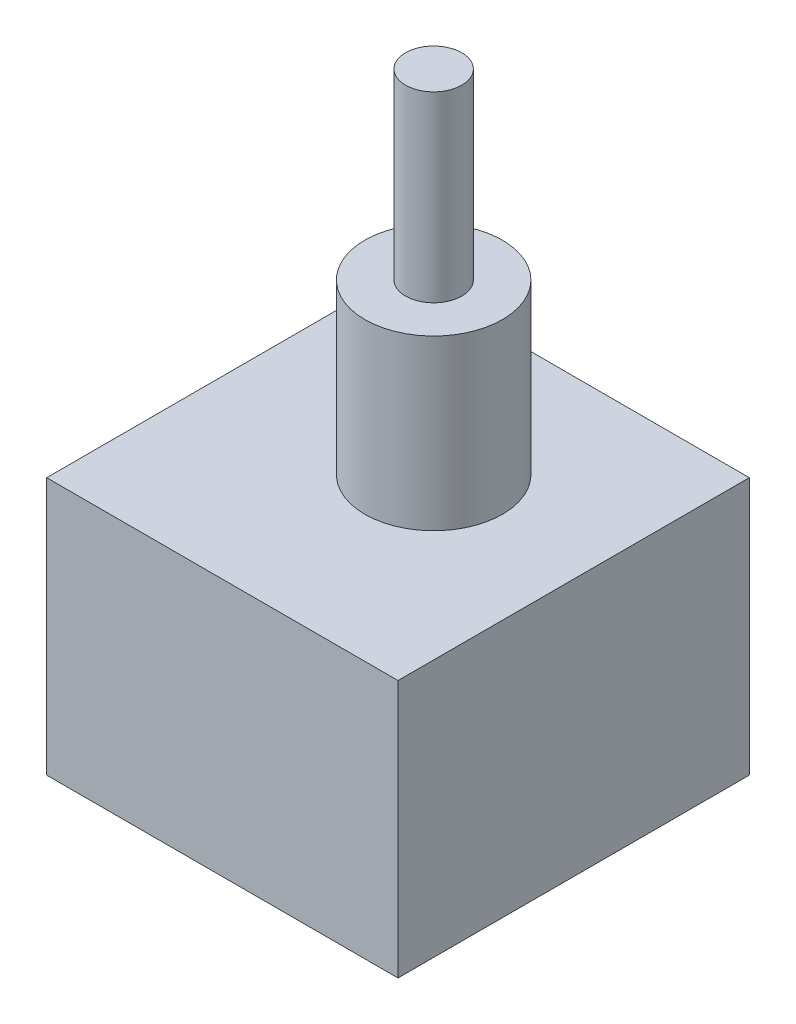
ISO-10303-21;
HEADER;
FILE_DESCRIPTION(('STEP AP214'),'2;1');
FILE_NAME('part.step','',(''),(''),'','','');
FILE_SCHEMA(('AUTOMOTIVE_DESIGN { 1 0 10303 214 1 1 1 1 }'));
ENDSEC;
DATA;
#1=APPLICATION_CONTEXT('core data for automotive mechanical design processes');
#2=APPLICATION_PROTOCOL_DEFINITION('international standard','automotive_design',2000,#1);
#3=PRODUCT_CONTEXT('',#1,'mechanical');
#4=PRODUCT('Part','Part','',(#3));
#5=PRODUCT_RELATED_PRODUCT_CATEGORY('part','',(#4));
#6=PRODUCT_DEFINITION_FORMATION('','',#4);
#7=PRODUCT_DEFINITION_CONTEXT('part definition',#1,'design');
#8=PRODUCT_DEFINITION('design','',#6,#7);
#9=PRODUCT_DEFINITION_SHAPE('','',#8);
#10=(LENGTH_UNIT() NAMED_UNIT(*) SI_UNIT(.MILLI.,.METRE.));
#11=(NAMED_UNIT(*) PLANE_ANGLE_UNIT() SI_UNIT($,.RADIAN.));
#12=(NAMED_UNIT(*) SI_UNIT($,.STERADIAN.) SOLID_ANGLE_UNIT());
#13=UNCERTAINTY_MEASURE_WITH_UNIT(LENGTH_MEASURE(1.E-05),#10,'distance_accuracy_value','');
#14=(GEOMETRIC_REPRESENTATION_CONTEXT(3) GLOBAL_UNCERTAINTY_ASSIGNED_CONTEXT((#13)) GLOBAL_UNIT_ASSIGNED_CONTEXT((#10,
#11,#12)) REPRESENTATION_CONTEXT('',''));
#15=CARTESIAN_POINT('',(0.,0.,0.));
#16=DIRECTION('',(0.,0.,1.));
#17=DIRECTION('',(1.,0.,0.));
#18=AXIS2_PLACEMENT_3D('',#15,#16,#17);
#19=CARTESIAN_POINT('',(-16.2944162436548,22.,-13.248730964467));
#20=DIRECTION('',(1.,0.,0.));
#21=DIRECTION('',(0.,0.,-1.));
#22=AXIS2_PLACEMENT_3D('',#19,#20,#21);
#23=PLANE('',#22);
#24=DIRECTION('',(0.,0.,1.));
#25=VECTOR('',#24,1.);
#26=CARTESIAN_POINT('',(-16.2944162436548,0.,-13.248730964467));
#27=LINE('',#26,#25);
#28=CARTESIAN_POINT('',(-16.2944162436548,0.,-13.248730964467));
#29=VERTEX_POINT('',#28);
#30=CARTESIAN_POINT('',(-16.2944162436548,0.,16.751269035533));
#31=VERTEX_POINT('',#30);
#32=EDGE_CURVE('E117',#29,#31,#27,.T.);
#33=ORIENTED_EDGE('',*,*,#32,.T.);
#34=DIRECTION('',(0.,-1.,0.));
#35=VECTOR('',#34,1.);
#36=CARTESIAN_POINT('',(-16.2944162436548,22.,16.751269035533));
#37=LINE('',#36,#35);
#38=CARTESIAN_POINT('',(-16.2944162436548,22.,16.751269035533));
#39=VERTEX_POINT('',#38);
#40=EDGE_CURVE('E48',#39,#31,#37,.T.);
#41=ORIENTED_EDGE('',*,*,#40,.F.);
#42=DIRECTION('',(0.,0.,1.));
#43=VECTOR('',#42,1.);
#44=CARTESIAN_POINT('',(-16.2944162436548,22.,-13.248730964467));
#45=LINE('',#44,#43);
#46=CARTESIAN_POINT('',(-16.2944162436548,22.,-13.248730964467));
#47=VERTEX_POINT('',#46);
#48=EDGE_CURVE('E100',#47,#39,#45,.T.);
#49=ORIENTED_EDGE('',*,*,#48,.F.);
#50=DIRECTION('',(0.,-1.,0.));
#51=VECTOR('',#50,1.);
#52=CARTESIAN_POINT('',(-16.2944162436548,22.,-13.248730964467));
#53=LINE('',#52,#51);
#54=EDGE_CURVE('E113',#47,#29,#53,.T.);
#55=ORIENTED_EDGE('',*,*,#54,.T.);
#56=EDGE_LOOP('',(#33,#41,#49,#55));
#57=FACE_BOUND('',#56,.T.);
#58=ADVANCED_FACE('F45',(#57),#23,.F.);
#59=CARTESIAN_POINT('',(-16.2944162436548,22.,16.751269035533));
#60=DIRECTION('',(0.,0.,-1.));
#61=DIRECTION('',(-1.,0.,0.));
#62=AXIS2_PLACEMENT_3D('',#59,#60,#61);
#63=PLANE('',#62);
#64=DIRECTION('',(1.,0.,0.));
#65=VECTOR('',#64,1.);
#66=CARTESIAN_POINT('',(-16.2944162436548,0.,16.751269035533));
#67=LINE('',#66,#65);
#68=CARTESIAN_POINT('',(13.7055837563452,0.,16.751269035533));
#69=VERTEX_POINT('',#68);
#70=EDGE_CURVE('E106',#31,#69,#67,.T.);
#71=ORIENTED_EDGE('',*,*,#70,.T.);
#72=DIRECTION('',(0.,-1.,0.));
#73=VECTOR('',#72,1.);
#74=CARTESIAN_POINT('',(13.7055837563452,22.,16.751269035533));
#75=LINE('',#74,#73);
#76=CARTESIAN_POINT('',(13.7055837563452,22.,16.751269035533));
#77=VERTEX_POINT('',#76);
#78=EDGE_CURVE('E104',#77,#69,#75,.T.);
#79=ORIENTED_EDGE('',*,*,#78,.F.);
#80=DIRECTION('',(1.,0.,0.));
#81=VECTOR('',#80,1.);
#82=CARTESIAN_POINT('',(-16.2944162436548,22.,16.751269035533));
#83=LINE('',#82,#81);
#84=EDGE_CURVE('E95',#39,#77,#83,.T.);
#85=ORIENTED_EDGE('',*,*,#84,.F.);
#86=ORIENTED_EDGE('',*,*,#40,.T.);
#87=EDGE_LOOP('',(#71,#79,#85,#86));
#88=FACE_BOUND('',#87,.T.);
#89=ADVANCED_FACE('F105',(#88),#63,.F.);
#90=CARTESIAN_POINT('',(13.7055837563452,22.,-13.248730964467));
#91=DIRECTION('',(-1.,0.,0.));
#92=DIRECTION('',(0.,0.,1.));
#93=AXIS2_PLACEMENT_3D('',#90,#91,#92);
#94=PLANE('',#93);
#95=DIRECTION('',(0.,0.,-1.));
#96=VECTOR('',#95,1.);
#97=CARTESIAN_POINT('',(13.7055837563452,0.,-13.248730964467));
#98=LINE('',#97,#96);
#99=CARTESIAN_POINT('',(13.7055837563452,0.,-13.248730964467));
#100=VERTEX_POINT('',#99);
#101=EDGE_CURVE('E81',#69,#100,#98,.T.);
#102=ORIENTED_EDGE('',*,*,#101,.T.);
#103=DIRECTION('',(0.,-1.,0.));
#104=VECTOR('',#103,1.);
#105=CARTESIAN_POINT('',(13.7055837563452,22.,-13.248730964467));
#106=LINE('',#105,#104);
#107=CARTESIAN_POINT('',(13.7055837563452,22.,-13.248730964467));
#108=VERTEX_POINT('',#107);
#109=EDGE_CURVE('E108',#108,#100,#106,.T.);
#110=ORIENTED_EDGE('',*,*,#109,.F.);
#111=DIRECTION('',(0.,0.,-1.));
#112=VECTOR('',#111,1.);
#113=CARTESIAN_POINT('',(13.7055837563452,22.,-13.248730964467));
#114=LINE('',#113,#112);
#115=EDGE_CURVE('E98',#77,#108,#114,.T.);
#116=ORIENTED_EDGE('',*,*,#115,.F.);
#117=ORIENTED_EDGE('',*,*,#78,.T.);
#118=EDGE_LOOP('',(#102,#110,#116,#117));
#119=FACE_BOUND('',#118,.T.);
#120=ADVANCED_FACE('F109',(#119),#94,.F.);
#121=CARTESIAN_POINT('',(-16.2944162436548,22.,-13.248730964467));
#122=DIRECTION('',(0.,0.,1.));
#123=DIRECTION('',(1.,0.,0.));
#124=AXIS2_PLACEMENT_3D('',#121,#122,#123);
#125=PLANE('',#124);
#126=DIRECTION('',(-1.,0.,0.));
#127=VECTOR('',#126,1.);
#128=CARTESIAN_POINT('',(-16.2944162436548,0.,-13.248730964467));
#129=LINE('',#128,#127);
#130=EDGE_CURVE('E87',#100,#29,#129,.T.);
#131=ORIENTED_EDGE('',*,*,#130,.T.);
#132=ORIENTED_EDGE('',*,*,#54,.F.);
#133=DIRECTION('',(-1.,0.,0.));
#134=VECTOR('',#133,1.);
#135=CARTESIAN_POINT('',(-16.2944162436548,22.,-13.248730964467));
#136=LINE('',#135,#134);
#137=EDGE_CURVE('E64',#108,#47,#136,.T.);
#138=ORIENTED_EDGE('',*,*,#137,.F.);
#139=ORIENTED_EDGE('',*,*,#109,.T.);
#140=EDGE_LOOP('',(#131,#132,#138,#139));
#141=FACE_BOUND('',#140,.T.);
#142=ADVANCED_FACE('F131',(#141),#125,.F.);
#143=CARTESIAN_POINT('',(0.,22.,0.));
#144=DIRECTION('',(0.,1.,0.));
#145=DIRECTION('',(0.,0.,1.));
#146=AXIS2_PLACEMENT_3D('',#143,#144,#145);
#147=PLANE('',#146);
#148=CARTESIAN_POINT('',(0.,22.,0.));
#149=DIRECTION('',(0.,1.,0.));
#150=DIRECTION('',(0.,0.,1.));
#151=AXIS2_PLACEMENT_3D('',#148,#149,#150);
#152=CIRCLE('',#151,5.875);
#153=CARTESIAN_POINT('',(0.,22.,5.875));
#154=VERTEX_POINT('',#153);
#155=EDGE_CURVE('E55',#154,#154,#152,.T.);
#156=ORIENTED_EDGE('',*,*,#155,.F.);
#157=EDGE_LOOP('',(#156));
#158=FACE_BOUND('',#157,.T.);
#159=ORIENTED_EDGE('',*,*,#48,.T.);
#160=ORIENTED_EDGE('',*,*,#84,.T.);
#161=ORIENTED_EDGE('',*,*,#115,.T.);
#162=ORIENTED_EDGE('',*,*,#137,.T.);
#163=EDGE_LOOP('',(#159,#160,#161,#162));
#164=FACE_BOUND('',#163,.T.);
#165=ADVANCED_FACE('F96',(#158,#164),#147,.T.);
#166=CARTESIAN_POINT('',(0.,0.,0.));
#167=DIRECTION('',(0.,1.,0.));
#168=DIRECTION('',(0.,0.,1.));
#169=AXIS2_PLACEMENT_3D('',#166,#167,#168);
#170=PLANE('',#169);
#171=ORIENTED_EDGE('',*,*,#32,.F.);
#172=ORIENTED_EDGE('',*,*,#130,.F.);
#173=ORIENTED_EDGE('',*,*,#101,.F.);
#174=ORIENTED_EDGE('',*,*,#70,.F.);
#175=EDGE_LOOP('',(#171,#172,#173,#174));
#176=FACE_BOUND('',#175,.T.);
#177=ADVANCED_FACE('F134',(#176),#170,.F.);
#178=CARTESIAN_POINT('',(0.,36.4,0.));
#179=DIRECTION('',(0.,-1.,0.));
#180=DIRECTION('',(0.,0.,-1.));
#181=AXIS2_PLACEMENT_3D('',#178,#179,#180);
#182=CYLINDRICAL_SURFACE('',#181,5.875);
#183=CARTESIAN_POINT('',(0.,36.4,0.));
#184=DIRECTION('',(0.,1.,0.));
#185=DIRECTION('',(0.,0.,1.));
#186=AXIS2_PLACEMENT_3D('',#183,#184,#185);
#187=CIRCLE('',#186,5.875);
#188=CARTESIAN_POINT('',(0.,36.4,5.875));
#189=VERTEX_POINT('',#188);
#190=EDGE_CURVE('E121',#189,#189,#187,.T.);
#191=ORIENTED_EDGE('',*,*,#190,.F.);
#192=EDGE_LOOP('',(#191));
#193=FACE_BOUND('',#192,.T.);
#194=ORIENTED_EDGE('',*,*,#155,.T.);
#195=EDGE_LOOP('',(#194));
#196=FACE_BOUND('',#195,.T.);
#197=ADVANCED_FACE('F160',(#193,#196),#182,.T.);
#198=CARTESIAN_POINT('',(0.,36.4,0.));
#199=DIRECTION('',(0.,1.,0.));
#200=DIRECTION('',(0.,0.,1.));
#201=AXIS2_PLACEMENT_3D('',#198,#199,#200);
#202=PLANE('',#201);
#203=CARTESIAN_POINT('',(0.,36.4,0.));
#204=DIRECTION('',(0.,1.,0.));
#205=DIRECTION('',(0.,0.,1.));
#206=AXIS2_PLACEMENT_3D('',#203,#204,#205);
#207=CIRCLE('',#206,2.4);
#208=CARTESIAN_POINT('',(0.,36.4,2.4));
#209=VERTEX_POINT('',#208);
#210=EDGE_CURVE('E11',#209,#209,#207,.T.);
#211=ORIENTED_EDGE('',*,*,#210,.F.);
#212=EDGE_LOOP('',(#211));
#213=FACE_BOUND('',#212,.T.);
#214=ORIENTED_EDGE('',*,*,#190,.T.);
#215=EDGE_LOOP('',(#214));
#216=FACE_BOUND('',#215,.T.);
#217=ADVANCED_FACE('F154',(#213,#216),#202,.T.);
#218=CARTESIAN_POINT('',(0.,52.,0.));
#219=DIRECTION('',(0.,-1.,0.));
#220=DIRECTION('',(0.,0.,-1.));
#221=AXIS2_PLACEMENT_3D('',#218,#219,#220);
#222=CYLINDRICAL_SURFACE('',#221,2.4);
#223=CARTESIAN_POINT('',(0.,52.,0.));
#224=DIRECTION('',(0.,1.,0.));
#225=DIRECTION('',(0.,0.,1.));
#226=AXIS2_PLACEMENT_3D('',#223,#224,#225);
#227=CIRCLE('',#226,2.4);
#228=CARTESIAN_POINT('',(0.,52.,2.4));
#229=VERTEX_POINT('',#228);
#230=EDGE_CURVE('E143',#229,#229,#227,.T.);
#231=ORIENTED_EDGE('',*,*,#230,.F.);
#232=EDGE_LOOP('',(#231));
#233=FACE_BOUND('',#232,.T.);
#234=ORIENTED_EDGE('',*,*,#210,.T.);
#235=EDGE_LOOP('',(#234));
#236=FACE_BOUND('',#235,.T.);
#237=ADVANCED_FACE('F151',(#233,#236),#222,.T.);
#238=CARTESIAN_POINT('',(0.,52.,0.));
#239=DIRECTION('',(0.,1.,0.));
#240=DIRECTION('',(0.,0.,1.));
#241=AXIS2_PLACEMENT_3D('',#238,#239,#240);
#242=PLANE('',#241);
#243=ORIENTED_EDGE('',*,*,#230,.T.);
#244=EDGE_LOOP('',(#243));
#245=FACE_BOUND('',#244,.T.);
#246=ADVANCED_FACE('F149',(#245),#242,.T.);
#247=CLOSED_SHELL('',(#58,#89,#120,#142,#165,#177,#197,#217,#237,#246));
#248=MANIFOLD_SOLID_BREP('B2',#247);
#249=ADVANCED_BREP_SHAPE_REPRESENTATION('',(#18,#248),#14);
#250=SHAPE_DEFINITION_REPRESENTATION(#9,#249);
ENDSEC;
END-ISO-10303-21;
